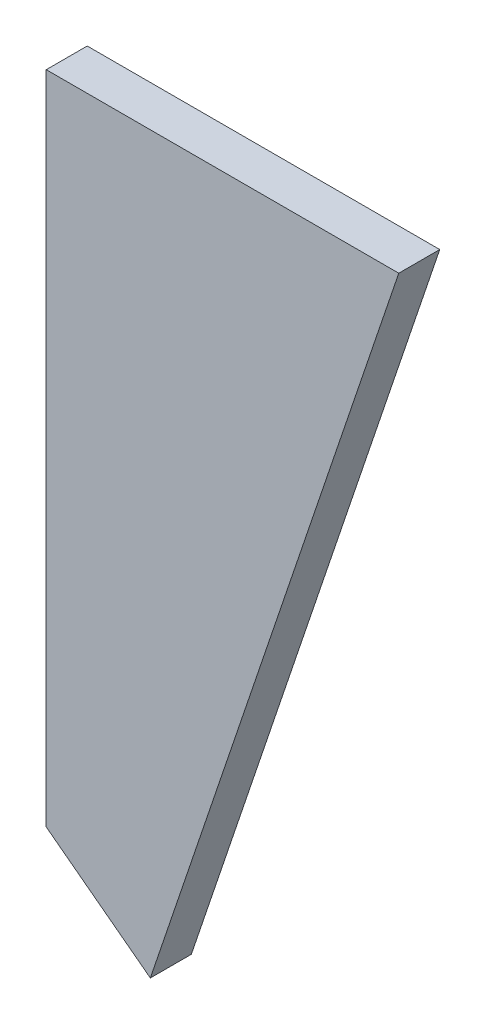
ISO-10303-21;
HEADER;
FILE_DESCRIPTION(('STEP AP214'),'2;1');
FILE_NAME('part.step','',(''),(''),'','','');
FILE_SCHEMA(('AUTOMOTIVE_DESIGN { 1 0 10303 214 1 1 1 1 }'));
ENDSEC;
DATA;
#1=APPLICATION_CONTEXT('core data for automotive mechanical design processes');
#2=APPLICATION_PROTOCOL_DEFINITION('international standard','automotive_design',2000,#1);
#3=PRODUCT_CONTEXT('',#1,'mechanical');
#4=PRODUCT('Part','Part','',(#3));
#5=PRODUCT_RELATED_PRODUCT_CATEGORY('part','',(#4));
#6=PRODUCT_DEFINITION_FORMATION('','',#4);
#7=PRODUCT_DEFINITION_CONTEXT('part definition',#1,'design');
#8=PRODUCT_DEFINITION('design','',#6,#7);
#9=PRODUCT_DEFINITION_SHAPE('','',#8);
#10=(LENGTH_UNIT() NAMED_UNIT(*) SI_UNIT(.MILLI.,.METRE.));
#11=(NAMED_UNIT(*) PLANE_ANGLE_UNIT() SI_UNIT($,.RADIAN.));
#12=(NAMED_UNIT(*) SI_UNIT($,.STERADIAN.) SOLID_ANGLE_UNIT());
#13=UNCERTAINTY_MEASURE_WITH_UNIT(LENGTH_MEASURE(1.E-05),#10,'distance_accuracy_value','');
#14=(GEOMETRIC_REPRESENTATION_CONTEXT(3) GLOBAL_UNCERTAINTY_ASSIGNED_CONTEXT((#13)) GLOBAL_UNIT_ASSIGNED_CONTEXT((#10,
#11,#12)) REPRESENTATION_CONTEXT('',''));
#15=CARTESIAN_POINT('',(0.,0.,0.));
#16=DIRECTION('',(0.,0.,1.));
#17=DIRECTION('',(1.,0.,0.));
#18=AXIS2_PLACEMENT_3D('',#15,#16,#17);
#19=CARTESIAN_POINT('',(0.,0.,3.));
#20=DIRECTION('',(0.603282864695709,0.797527294306934,0.));
#21=DIRECTION('',(-0.797527294306934,0.603282864695709,0.));
#22=AXIS2_PLACEMENT_3D('',#19,#20,#21);
#23=PLANE('',#22);
#24=DIRECTION('',(0.797527294306934,-0.603282864695709,0.));
#25=VECTOR('',#24,1.);
#26=CARTESIAN_POINT('',(0.,0.,0.));
#27=LINE('',#26,#25);
#28=CARTESIAN_POINT('',(0.,0.,0.));
#29=VERTEX_POINT('',#28);
#30=CARTESIAN_POINT('',(7.61808998416681,-5.76264057915627,0.));
#31=VERTEX_POINT('',#30);
#32=EDGE_CURVE('E109',#29,#31,#27,.T.);
#33=ORIENTED_EDGE('',*,*,#32,.T.);
#34=DIRECTION('',(0.,0.,-1.));
#35=VECTOR('',#34,1.);
#36=CARTESIAN_POINT('',(7.61808998416681,-5.76264057915627,3.));
#37=LINE('',#36,#35);
#38=CARTESIAN_POINT('',(7.61808998416681,-5.76264057915627,3.));
#39=VERTEX_POINT('',#38);
#40=EDGE_CURVE('E11',#39,#31,#37,.T.);
#41=ORIENTED_EDGE('',*,*,#40,.F.);
#42=DIRECTION('',(0.797527294306934,-0.603282864695709,0.));
#43=VECTOR('',#42,1.);
#44=CARTESIAN_POINT('',(0.,0.,3.));
#45=LINE('',#44,#43);
#46=CARTESIAN_POINT('',(0.,0.,3.));
#47=VERTEX_POINT('',#46);
#48=EDGE_CURVE('E92',#47,#39,#45,.T.);
#49=ORIENTED_EDGE('',*,*,#48,.F.);
#50=DIRECTION('',(0.,0.,-1.));
#51=VECTOR('',#50,1.);
#52=CARTESIAN_POINT('',(0.,0.,3.));
#53=LINE('',#52,#51);
#54=EDGE_CURVE('E105',#47,#29,#53,.T.);
#55=ORIENTED_EDGE('',*,*,#54,.T.);
#56=EDGE_LOOP('',(#33,#41,#49,#55));
#57=FACE_BOUND('',#56,.T.);
#58=ADVANCED_FACE('F40',(#57),#23,.F.);
#59=CARTESIAN_POINT('',(7.61808998416681,-5.76264057915627,3.));
#60=DIRECTION('',(-0.94729446838097,0.320364152449702,0.));
#61=DIRECTION('',(-0.320364152449702,-0.94729446838097,0.));
#62=AXIS2_PLACEMENT_3D('',#59,#60,#61);
#63=PLANE('',#62);
#64=DIRECTION('',(0.320364152449702,0.94729446838097,0.));
#65=VECTOR('',#64,1.);
#66=CARTESIAN_POINT('',(7.61808998416681,-5.76264057915627,0.));
#67=LINE('',#66,#65);
#68=CARTESIAN_POINT('',(25.8,48.,0.));
#69=VERTEX_POINT('',#68);
#70=EDGE_CURVE('E97',#31,#69,#67,.T.);
#71=ORIENTED_EDGE('',*,*,#70,.T.);
#72=DIRECTION('',(0.,0.,-1.));
#73=VECTOR('',#72,1.);
#74=CARTESIAN_POINT('',(25.8,48.,3.));
#75=LINE('',#74,#73);
#76=CARTESIAN_POINT('',(25.8,48.,3.));
#77=VERTEX_POINT('',#76);
#78=EDGE_CURVE('E49',#77,#69,#75,.T.);
#79=ORIENTED_EDGE('',*,*,#78,.F.);
#80=DIRECTION('',(0.320364152449702,0.94729446838097,0.));
#81=VECTOR('',#80,1.);
#82=CARTESIAN_POINT('',(7.61808998416681,-5.76264057915627,3.));
#83=LINE('',#82,#81);
#84=EDGE_CURVE('E87',#39,#77,#83,.T.);
#85=ORIENTED_EDGE('',*,*,#84,.F.);
#86=ORIENTED_EDGE('',*,*,#40,.T.);
#87=EDGE_LOOP('',(#71,#79,#85,#86));
#88=FACE_BOUND('',#87,.T.);
#89=ADVANCED_FACE('F96',(#88),#63,.F.);
#90=CARTESIAN_POINT('',(25.8,48.,3.));
#91=DIRECTION('',(0.,-1.,0.));
#92=DIRECTION('',(0.,0.,-1.));
#93=AXIS2_PLACEMENT_3D('',#90,#91,#92);
#94=PLANE('',#93);
#95=DIRECTION('',(-1.,0.,0.));
#96=VECTOR('',#95,1.);
#97=CARTESIAN_POINT('',(25.8,48.,0.));
#98=LINE('',#97,#96);
#99=CARTESIAN_POINT('',(0.,48.,0.));
#100=VERTEX_POINT('',#99);
#101=EDGE_CURVE('E74',#69,#100,#98,.T.);
#102=ORIENTED_EDGE('',*,*,#101,.T.);
#103=DIRECTION('',(0.,0.,-1.));
#104=VECTOR('',#103,1.);
#105=CARTESIAN_POINT('',(0.,48.,3.));
#106=LINE('',#105,#104);
#107=CARTESIAN_POINT('',(0.,48.,3.));
#108=VERTEX_POINT('',#107);
#109=EDGE_CURVE('E99',#108,#100,#106,.T.);
#110=ORIENTED_EDGE('',*,*,#109,.F.);
#111=DIRECTION('',(-1.,0.,0.));
#112=VECTOR('',#111,1.);
#113=CARTESIAN_POINT('',(25.8,48.,3.));
#114=LINE('',#113,#112);
#115=EDGE_CURVE('E90',#77,#108,#114,.T.);
#116=ORIENTED_EDGE('',*,*,#115,.F.);
#117=ORIENTED_EDGE('',*,*,#78,.T.);
#118=EDGE_LOOP('',(#102,#110,#116,#117));
#119=FACE_BOUND('',#118,.T.);
#120=ADVANCED_FACE('F100',(#119),#94,.F.);
#121=CARTESIAN_POINT('',(0.,48.,3.));
#122=DIRECTION('',(1.,0.,0.));
#123=DIRECTION('',(0.,0.,-1.));
#124=AXIS2_PLACEMENT_3D('',#121,#122,#123);
#125=PLANE('',#124);
#126=DIRECTION('',(0.,-1.,0.));
#127=VECTOR('',#126,1.);
#128=CARTESIAN_POINT('',(0.,48.,0.));
#129=LINE('',#128,#127);
#130=EDGE_CURVE('E80',#100,#29,#129,.T.);
#131=ORIENTED_EDGE('',*,*,#130,.T.);
#132=ORIENTED_EDGE('',*,*,#54,.F.);
#133=DIRECTION('',(0.,-1.,0.));
#134=VECTOR('',#133,1.);
#135=CARTESIAN_POINT('',(0.,48.,3.));
#136=LINE('',#135,#134);
#137=EDGE_CURVE('E57',#108,#47,#136,.T.);
#138=ORIENTED_EDGE('',*,*,#137,.F.);
#139=ORIENTED_EDGE('',*,*,#109,.T.);
#140=EDGE_LOOP('',(#131,#132,#138,#139));
#141=FACE_BOUND('',#140,.T.);
#142=ADVANCED_FACE('F123',(#141),#125,.F.);
#143=CARTESIAN_POINT('',(0.,0.,3.));
#144=DIRECTION('',(0.,0.,1.));
#145=DIRECTION('',(1.,0.,0.));
#146=AXIS2_PLACEMENT_3D('',#143,#144,#145);
#147=PLANE('',#146);
#148=ORIENTED_EDGE('',*,*,#48,.T.);
#149=ORIENTED_EDGE('',*,*,#84,.T.);
#150=ORIENTED_EDGE('',*,*,#115,.T.);
#151=ORIENTED_EDGE('',*,*,#137,.T.);
#152=EDGE_LOOP('',(#148,#149,#150,#151));
#153=FACE_BOUND('',#152,.T.);
#154=ADVANCED_FACE('F88',(#153),#147,.T.);
#155=CARTESIAN_POINT('',(0.,0.,0.));
#156=DIRECTION('',(0.,0.,1.));
#157=DIRECTION('',(1.,0.,0.));
#158=AXIS2_PLACEMENT_3D('',#155,#156,#157);
#159=PLANE('',#158);
#160=ORIENTED_EDGE('',*,*,#32,.F.);
#161=ORIENTED_EDGE('',*,*,#130,.F.);
#162=ORIENTED_EDGE('',*,*,#101,.F.);
#163=ORIENTED_EDGE('',*,*,#70,.F.);
#164=EDGE_LOOP('',(#160,#161,#162,#163));
#165=FACE_BOUND('',#164,.T.);
#166=ADVANCED_FACE('F126',(#165),#159,.F.);
#167=CLOSED_SHELL('',(#58,#89,#120,#142,#154,#166));
#168=MANIFOLD_SOLID_BREP('B2',#167);
#169=ADVANCED_BREP_SHAPE_REPRESENTATION('',(#18,#168),#14);
#170=SHAPE_DEFINITION_REPRESENTATION(#9,#169);
ENDSEC;
END-ISO-10303-21;
